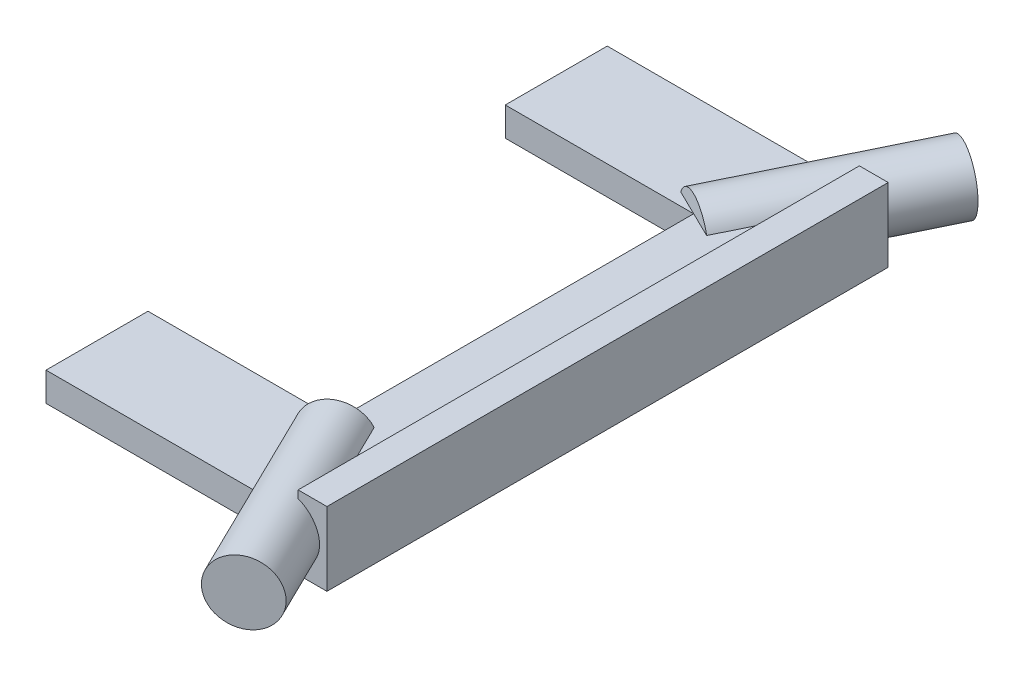
ISO-10303-21;
HEADER;
FILE_DESCRIPTION(('STEP AP214'),'2;1');
FILE_NAME('part.step','',(''),(''),'','','');
FILE_SCHEMA(('AUTOMOTIVE_DESIGN { 1 0 10303 214 1 1 1 1 }'));
ENDSEC;
DATA;
#1=APPLICATION_CONTEXT('core data for automotive mechanical design processes');
#2=APPLICATION_PROTOCOL_DEFINITION('international standard','automotive_design',2000,#1);
#3=PRODUCT_CONTEXT('',#1,'mechanical');
#4=PRODUCT('Part','Part','',(#3));
#5=PRODUCT_RELATED_PRODUCT_CATEGORY('part','',(#4));
#6=PRODUCT_DEFINITION_FORMATION('','',#4);
#7=PRODUCT_DEFINITION_CONTEXT('part definition',#1,'design');
#8=PRODUCT_DEFINITION('design','',#6,#7);
#9=PRODUCT_DEFINITION_SHAPE('','',#8);
#10=(LENGTH_UNIT() NAMED_UNIT(*) SI_UNIT(.MILLI.,.METRE.));
#11=(NAMED_UNIT(*) PLANE_ANGLE_UNIT() SI_UNIT($,.RADIAN.));
#12=(NAMED_UNIT(*) SI_UNIT($,.STERADIAN.) SOLID_ANGLE_UNIT());
#13=UNCERTAINTY_MEASURE_WITH_UNIT(LENGTH_MEASURE(1.E-05),#10,'distance_accuracy_value','');
#14=(GEOMETRIC_REPRESENTATION_CONTEXT(3) GLOBAL_UNCERTAINTY_ASSIGNED_CONTEXT((#13)) GLOBAL_UNIT_ASSIGNED_CONTEXT((#10,
#11,#12)) REPRESENTATION_CONTEXT('',''));
#15=CARTESIAN_POINT('',(0.,0.,0.));
#16=DIRECTION('',(0.,0.,1.));
#17=DIRECTION('',(1.,0.,0.));
#18=AXIS2_PLACEMENT_3D('',#15,#16,#17);
#19=CARTESIAN_POINT('',(0.,2.5,0.));
#20=DIRECTION('',(0.,-1.,0.));
#21=DIRECTION('',(0.,0.,-1.));
#22=AXIS2_PLACEMENT_3D('',#19,#20,#21);
#23=PLANE('',#22);
#24=DIRECTION('',(-1.,0.,0.));
#25=VECTOR('',#24,1.);
#26=CARTESIAN_POINT('',(-36.055,2.5,-48.7));
#27=LINE('',#26,#25);
#28=CARTESIAN_POINT('',(23.1966005210723,2.5,-48.7));
#29=VERTEX_POINT('',#28);
#30=CARTESIAN_POINT('',(-12.7,2.5,-48.7));
#31=VERTEX_POINT('',#30);
#32=EDGE_CURVE('E179',#29,#31,#27,.T.);
#33=ORIENTED_EDGE('',*,*,#32,.T.);
#34=DIRECTION('',(0.,0.,1.));
#35=VECTOR('',#34,1.);
#36=CARTESIAN_POINT('',(-12.7,2.5,0.));
#37=LINE('',#36,#35);
#38=CARTESIAN_POINT('',(-12.7,2.5,-31.));
#39=VERTEX_POINT('',#38);
#40=EDGE_CURVE('E169',#31,#39,#37,.T.);
#41=ORIENTED_EDGE('',*,*,#40,.T.);
#42=DIRECTION('',(1.,0.,0.));
#43=VECTOR('',#42,1.);
#44=CARTESIAN_POINT('',(0.,2.5,-31.));
#45=LINE('',#44,#43);
#46=CARTESIAN_POINT('',(20.,2.5,-31.));
#47=VERTEX_POINT('',#46);
#48=EDGE_CURVE('E176',#39,#47,#45,.T.);
#49=ORIENTED_EDGE('',*,*,#48,.T.);
#50=DIRECTION('',(0.898467181300484,0.,0.439040686185192));
#51=VECTOR('',#50,1.);
#52=CARTESIAN_POINT('',(16.0835075641035,2.5,-32.9138145079559));
#53=LINE('',#52,#51);
#54=CARTESIAN_POINT('',(15.5984277103543,2.5,-33.1508513149502));
#55=VERTEX_POINT('',#54);
#56=EDGE_CURVE('E306',#55,#47,#53,.T.);
#57=ORIENTED_EDGE('',*,*,#56,.F.);
#58=DIRECTION('',(-0.439040686185192,0.,0.898467181300484));
#59=VECTOR('',#58,1.);
#60=CARTESIAN_POINT('',(15.5984277103543,2.5,-33.1508513149502));
#61=LINE('',#60,#59);
#62=EDGE_CURVE('E314',#29,#55,#61,.T.);
#63=ORIENTED_EDGE('',*,*,#62,.F.);
#64=EDGE_LOOP('',(#33,#41,#49,#57,#63));
#65=FACE_BOUND('',#64,.T.);
#66=ADVANCED_FACE('F34',(#65),#23,.F.);
#67=CARTESIAN_POINT('',(0.,-2.5,0.));
#68=DIRECTION('',(0.,-1.,0.));
#69=DIRECTION('',(0.,0.,-1.));
#70=AXIS2_PLACEMENT_3D('',#67,#68,#69);
#71=PLANE('',#70);
#72=DIRECTION('',(0.,0.,1.));
#73=VECTOR('',#72,1.);
#74=CARTESIAN_POINT('',(-12.7,-2.5,0.));
#75=LINE('',#74,#73);
#76=CARTESIAN_POINT('',(-12.7,-2.5,-48.7));
#77=VERTEX_POINT('',#76);
#78=CARTESIAN_POINT('',(-12.7,-2.5,-31.));
#79=VERTEX_POINT('',#78);
#80=EDGE_CURVE('E57',#77,#79,#75,.T.);
#81=ORIENTED_EDGE('',*,*,#80,.F.);
#82=DIRECTION('',(-1.,0.,0.));
#83=VECTOR('',#82,1.);
#84=CARTESIAN_POINT('',(-36.055,-2.5,-48.7));
#85=LINE('',#84,#83);
#86=CARTESIAN_POINT('',(23.1966005210723,-2.5,-48.7));
#87=VERTEX_POINT('',#86);
#88=EDGE_CURVE('E233',#87,#77,#85,.T.);
#89=ORIENTED_EDGE('',*,*,#88,.F.);
#90=DIRECTION('',(-0.439040686185192,0.,0.898467181300484));
#91=VECTOR('',#90,1.);
#92=CARTESIAN_POINT('',(15.5984277103543,-2.5,-33.1508513149502));
#93=LINE('',#92,#91);
#94=CARTESIAN_POINT('',(15.5984277103543,-2.5,-33.1508513149502));
#95=VERTEX_POINT('',#94);
#96=EDGE_CURVE('E312',#87,#95,#93,.T.);
#97=ORIENTED_EDGE('',*,*,#96,.T.);
#98=DIRECTION('',(0.898467181300484,0.,0.439040686185192));
#99=VECTOR('',#98,1.);
#100=CARTESIAN_POINT('',(16.0835075641035,-2.5,-32.9138145079559));
#101=LINE('',#100,#99);
#102=CARTESIAN_POINT('',(20.,-2.5,-31.));
#103=VERTEX_POINT('',#102);
#104=EDGE_CURVE('E324',#95,#103,#101,.T.);
#105=ORIENTED_EDGE('',*,*,#104,.T.);
#106=DIRECTION('',(1.,0.,0.));
#107=VECTOR('',#106,1.);
#108=CARTESIAN_POINT('',(0.,-2.5,-31.));
#109=LINE('',#108,#107);
#110=EDGE_CURVE('E245',#79,#103,#109,.T.);
#111=ORIENTED_EDGE('',*,*,#110,.F.);
#112=EDGE_LOOP('',(#81,#89,#97,#105,#111));
#113=FACE_BOUND('',#112,.T.);
#114=ADVANCED_FACE('F332',(#113),#71,.T.);
#115=DIRECTION('',(-1.,0.,0.));
#116=VECTOR('',#115,1.);
#117=CARTESIAN_POINT('',(0.,2.5,31.));
#118=LINE('',#117,#116);
#119=CARTESIAN_POINT('',(20.,2.5,31.));
#120=VERTEX_POINT('',#119);
#121=CARTESIAN_POINT('',(-12.7,2.5,31.));
#122=VERTEX_POINT('',#121);
#123=EDGE_CURVE('E187',#120,#122,#118,.T.);
#124=ORIENTED_EDGE('',*,*,#123,.T.);
#125=CARTESIAN_POINT('',(-12.7,2.5,48.7));
#126=VERTEX_POINT('',#125);
#127=EDGE_CURVE('E49',#122,#126,#37,.T.);
#128=ORIENTED_EDGE('',*,*,#127,.T.);
#129=DIRECTION('',(1.,0.,0.));
#130=VECTOR('',#129,1.);
#131=CARTESIAN_POINT('',(-36.055,2.5,48.7));
#132=LINE('',#131,#130);
#133=CARTESIAN_POINT('',(23.1966005210723,2.5,48.7));
#134=VERTEX_POINT('',#133);
#135=EDGE_CURVE('E235',#126,#134,#132,.T.);
#136=ORIENTED_EDGE('',*,*,#135,.T.);
#137=DIRECTION('',(-0.439040686185192,0.,-0.898467181300484));
#138=VECTOR('',#137,1.);
#139=CARTESIAN_POINT('',(15.5984277103543,2.5,33.1508513149502));
#140=LINE('',#139,#138);
#141=CARTESIAN_POINT('',(15.5984277103543,2.5,33.1508513149502));
#142=VERTEX_POINT('',#141);
#143=EDGE_CURVE('E361',#142,#134,#140,.F.);
#144=ORIENTED_EDGE('',*,*,#143,.F.);
#145=DIRECTION('',(-0.898467181300484,0.,0.439040686185192));
#146=VECTOR('',#145,1.);
#147=CARTESIAN_POINT('',(16.0835075641035,2.5,32.9138145079559));
#148=LINE('',#147,#146);
#149=EDGE_CURVE('E398',#120,#142,#148,.T.);
#150=ORIENTED_EDGE('',*,*,#149,.F.);
#151=EDGE_LOOP('',(#124,#128,#136,#144,#150));
#152=FACE_BOUND('',#151,.T.);
#153=ADVANCED_FACE('F383',(#152),#23,.F.);
#154=CARTESIAN_POINT('',(24.4015722896457,2.5,28.8491486850498));
#155=VERTEX_POINT('',#154);
#156=EDGE_CURVE('E404',#155,#120,#148,.T.);
#157=ORIENTED_EDGE('',*,*,#156,.F.);
#158=DIRECTION('',(-0.439040686185192,0.,-0.898467181300484));
#159=VECTOR('',#158,1.);
#160=CARTESIAN_POINT('',(24.4015722896457,2.5,28.8491486850498));
#161=LINE('',#160,#159);
#162=CARTESIAN_POINT('',(31.055,2.5,42.4649401800253));
#163=VERTEX_POINT('',#162);
#164=EDGE_CURVE('E262',#163,#155,#161,.T.);
#165=ORIENTED_EDGE('',*,*,#164,.F.);
#166=DIRECTION('',(0.,0.,1.));
#167=VECTOR('',#166,1.);
#168=CARTESIAN_POINT('',(31.055,2.5,0.));
#169=LINE('',#168,#167);
#170=CARTESIAN_POINT('',(31.055,2.5,-42.4649401800253));
#171=VERTEX_POINT('',#170);
#172=EDGE_CURVE('E231',#171,#163,#169,.T.);
#173=ORIENTED_EDGE('',*,*,#172,.F.);
#174=DIRECTION('',(-0.439040686185192,0.,0.898467181300484));
#175=VECTOR('',#174,1.);
#176=CARTESIAN_POINT('',(24.4015722896457,2.5,-28.8491486850498));
#177=LINE('',#176,#175);
#178=CARTESIAN_POINT('',(24.4015722896457,2.5,-28.8491486850498));
#179=VERTEX_POINT('',#178);
#180=EDGE_CURVE('E293',#179,#171,#177,.F.);
#181=ORIENTED_EDGE('',*,*,#180,.F.);
#182=EDGE_CURVE('E319',#47,#179,#53,.T.);
#183=ORIENTED_EDGE('',*,*,#182,.F.);
#184=DIRECTION('',(0.,0.,1.));
#185=VECTOR('',#184,1.);
#186=CARTESIAN_POINT('',(20.,2.5,0.));
#187=LINE('',#186,#185);
#188=EDGE_CURVE('E191',#47,#120,#187,.T.);
#189=ORIENTED_EDGE('',*,*,#188,.T.);
#190=EDGE_LOOP('',(#157,#165,#173,#181,#183,#189));
#191=FACE_BOUND('',#190,.T.);
#192=ADVANCED_FACE('F292',(#191),#23,.F.);
#193=CARTESIAN_POINT('',(-12.7,-2.5,31.));
#194=VERTEX_POINT('',#193);
#195=CARTESIAN_POINT('',(-12.7,-2.5,48.7));
#196=VERTEX_POINT('',#195);
#197=EDGE_CURVE('E423',#194,#196,#75,.T.);
#198=ORIENTED_EDGE('',*,*,#197,.F.);
#199=DIRECTION('',(-1.,0.,0.));
#200=VECTOR('',#199,1.);
#201=CARTESIAN_POINT('',(0.,-2.5,31.));
#202=LINE('',#201,#200);
#203=CARTESIAN_POINT('',(20.,-2.5,31.));
#204=VERTEX_POINT('',#203);
#205=EDGE_CURVE('E247',#204,#194,#202,.T.);
#206=ORIENTED_EDGE('',*,*,#205,.F.);
#207=DIRECTION('',(-0.898467181300484,0.,0.439040686185192));
#208=VECTOR('',#207,1.);
#209=CARTESIAN_POINT('',(16.0835075641035,-2.5,32.9138145079559));
#210=LINE('',#209,#208);
#211=CARTESIAN_POINT('',(15.5984277103543,-2.5,33.1508513149502));
#212=VERTEX_POINT('',#211);
#213=EDGE_CURVE('E409',#204,#212,#210,.T.);
#214=ORIENTED_EDGE('',*,*,#213,.T.);
#215=DIRECTION('',(-0.439040686185192,0.,-0.898467181300484));
#216=VECTOR('',#215,1.);
#217=CARTESIAN_POINT('',(15.5984277103543,-2.5,33.1508513149502));
#218=LINE('',#217,#216);
#219=CARTESIAN_POINT('',(23.1966005210723,-2.5,48.7));
#220=VERTEX_POINT('',#219);
#221=EDGE_CURVE('E359',#212,#220,#218,.F.);
#222=ORIENTED_EDGE('',*,*,#221,.T.);
#223=DIRECTION('',(1.,0.,0.));
#224=VECTOR('',#223,1.);
#225=CARTESIAN_POINT('',(-36.055,-2.5,48.7));
#226=LINE('',#225,#224);
#227=EDGE_CURVE('E236',#196,#220,#226,.T.);
#228=ORIENTED_EDGE('',*,*,#227,.F.);
#229=EDGE_LOOP('',(#198,#206,#214,#222,#228));
#230=FACE_BOUND('',#229,.T.);
#231=ADVANCED_FACE('F388',(#230),#71,.T.);
#232=DIRECTION('',(-0.439040686185192,0.,-0.898467181300484));
#233=VECTOR('',#232,1.);
#234=CARTESIAN_POINT('',(24.4015722896457,-2.5,28.8491486850498));
#235=LINE('',#234,#233);
#236=CARTESIAN_POINT('',(31.055,-2.5,42.4649401800253));
#237=VERTEX_POINT('',#236);
#238=CARTESIAN_POINT('',(24.4015722896457,-2.5,28.8491486850498));
#239=VERTEX_POINT('',#238);
#240=EDGE_CURVE('E352',#237,#239,#235,.T.);
#241=ORIENTED_EDGE('',*,*,#240,.T.);
#242=EDGE_CURVE('E345',#239,#204,#210,.T.);
#243=ORIENTED_EDGE('',*,*,#242,.T.);
#244=DIRECTION('',(0.,0.,1.));
#245=VECTOR('',#244,1.);
#246=CARTESIAN_POINT('',(20.,-2.5,0.));
#247=LINE('',#246,#245);
#248=EDGE_CURVE('E250',#103,#204,#247,.T.);
#249=ORIENTED_EDGE('',*,*,#248,.F.);
#250=CARTESIAN_POINT('',(24.4015722896457,-2.5,-28.8491486850498));
#251=VERTEX_POINT('',#250);
#252=EDGE_CURVE('E320',#103,#251,#101,.T.);
#253=ORIENTED_EDGE('',*,*,#252,.T.);
#254=DIRECTION('',(-0.439040686185192,0.,0.898467181300484));
#255=VECTOR('',#254,1.);
#256=CARTESIAN_POINT('',(24.4015722896457,-2.5,-28.8491486850498));
#257=LINE('',#256,#255);
#258=CARTESIAN_POINT('',(31.055,-2.5,-42.4649401800253));
#259=VERTEX_POINT('',#258);
#260=EDGE_CURVE('E304',#251,#259,#257,.F.);
#261=ORIENTED_EDGE('',*,*,#260,.T.);
#262=DIRECTION('',(0.,0.,1.));
#263=VECTOR('',#262,1.);
#264=CARTESIAN_POINT('',(31.055,-2.5,0.));
#265=LINE('',#264,#263);
#266=EDGE_CURVE('E228',#259,#237,#265,.T.);
#267=ORIENTED_EDGE('',*,*,#266,.T.);
#268=EDGE_LOOP('',(#241,#243,#249,#253,#261,#267));
#269=FACE_BOUND('',#268,.T.);
#270=ADVANCED_FACE('F342',(#269),#71,.T.);
#271=CARTESIAN_POINT('',(-36.055,2.5,48.7));
#272=DIRECTION('',(0.,0.,-1.));
#273=DIRECTION('',(-1.,0.,0.));
#274=AXIS2_PLACEMENT_3D('',#271,#272,#273);
#275=PLANE('',#274);
#276=CARTESIAN_POINT('',(28.649197552469,0.,48.7));
#277=DIRECTION('',(0.,0.,-1.));
#278=DIRECTION('',(-1.,0.,0.));
#279=AXIS2_PLACEMENT_3D('',#276,#277,#278);
#280=ELLIPSE('',#279,6.12153689580408,5.50000000000001);
#281=CARTESIAN_POINT('',(31.055,-5.05744682779402,48.7));
#282=VERTEX_POINT('',#281);
#283=CARTESIAN_POINT('',(31.055,5.05744682779403,48.7));
#284=VERTEX_POINT('',#283);
#285=EDGE_CURVE('E265',#282,#284,#280,.F.);
#286=ORIENTED_EDGE('',*,*,#285,.F.);
#287=DIRECTION('',(0.,-1.,0.));
#288=VECTOR('',#287,1.);
#289=CARTESIAN_POINT('',(31.055,6.375,48.7));
#290=LINE('',#289,#288);
#291=CARTESIAN_POINT('',(31.055,-6.375,48.7));
#292=VERTEX_POINT('',#291);
#293=EDGE_CURVE('E211',#282,#292,#290,.T.);
#294=ORIENTED_EDGE('',*,*,#293,.T.);
#295=DIRECTION('',(1.,0.,0.));
#296=VECTOR('',#295,1.);
#297=CARTESIAN_POINT('',(36.055,-6.375,48.7));
#298=LINE('',#297,#296);
#299=CARTESIAN_POINT('',(36.055,-6.375,48.7));
#300=VERTEX_POINT('',#299);
#301=EDGE_CURVE('E204',#292,#300,#298,.T.);
#302=ORIENTED_EDGE('',*,*,#301,.T.);
#303=DIRECTION('',(0.,-1.,0.));
#304=VECTOR('',#303,1.);
#305=CARTESIAN_POINT('',(36.055,2.5,48.7));
#306=LINE('',#305,#304);
#307=CARTESIAN_POINT('',(36.055,6.375,48.7));
#308=VERTEX_POINT('',#307);
#309=EDGE_CURVE('E238',#308,#300,#306,.T.);
#310=ORIENTED_EDGE('',*,*,#309,.F.);
#311=DIRECTION('',(1.,0.,0.));
#312=VECTOR('',#311,1.);
#313=CARTESIAN_POINT('',(36.055,6.375,48.7));
#314=LINE('',#313,#312);
#315=CARTESIAN_POINT('',(31.055,6.375,48.7));
#316=VERTEX_POINT('',#315);
#317=EDGE_CURVE('E208',#316,#308,#314,.T.);
#318=ORIENTED_EDGE('',*,*,#317,.F.);
#319=EDGE_CURVE('E222',#316,#284,#290,.T.);
#320=ORIENTED_EDGE('',*,*,#319,.T.);
#321=EDGE_LOOP('',(#286,#294,#302,#310,#318,#320));
#322=FACE_BOUND('',#321,.T.);
#323=ADVANCED_FACE('F273',(#322),#275,.F.);
#324=CARTESIAN_POINT('',(-36.055,2.5,-48.7));
#325=DIRECTION('',(0.,0.,1.));
#326=DIRECTION('',(1.,0.,0.));
#327=AXIS2_PLACEMENT_3D('',#324,#325,#326);
#328=PLANE('',#327);
#329=CARTESIAN_POINT('',(28.649197552469,0.,-48.7));
#330=DIRECTION('',(0.,0.,1.));
#331=DIRECTION('',(-1.,0.,0.));
#332=AXIS2_PLACEMENT_3D('',#329,#330,#331);
#333=ELLIPSE('',#332,6.12153689580408,5.50000000000001);
#334=CARTESIAN_POINT('',(31.055,5.05744682779403,-48.7));
#335=VERTEX_POINT('',#334);
#336=CARTESIAN_POINT('',(31.055,-5.05744682779403,-48.7));
#337=VERTEX_POINT('',#336);
#338=EDGE_CURVE('E288',#335,#337,#333,.F.);
#339=ORIENTED_EDGE('',*,*,#338,.F.);
#340=DIRECTION('',(0.,-1.,0.));
#341=VECTOR('',#340,1.);
#342=CARTESIAN_POINT('',(31.055,6.375,-48.7));
#343=LINE('',#342,#341);
#344=CARTESIAN_POINT('',(31.055,6.375,-48.7));
#345=VERTEX_POINT('',#344);
#346=EDGE_CURVE('E226',#345,#335,#343,.T.);
#347=ORIENTED_EDGE('',*,*,#346,.F.);
#348=DIRECTION('',(-1.,0.,0.));
#349=VECTOR('',#348,1.);
#350=CARTESIAN_POINT('',(36.055,6.375,-48.7));
#351=LINE('',#350,#349);
#352=CARTESIAN_POINT('',(36.055,6.375,-48.7));
#353=VERTEX_POINT('',#352);
#354=EDGE_CURVE('E203',#353,#345,#351,.T.);
#355=ORIENTED_EDGE('',*,*,#354,.F.);
#356=DIRECTION('',(0.,-1.,0.));
#357=VECTOR('',#356,1.);
#358=CARTESIAN_POINT('',(36.055,2.5,-48.7));
#359=LINE('',#358,#357);
#360=CARTESIAN_POINT('',(36.055,-6.375,-48.7));
#361=VERTEX_POINT('',#360);
#362=EDGE_CURVE('E243',#353,#361,#359,.T.);
#363=ORIENTED_EDGE('',*,*,#362,.T.);
#364=DIRECTION('',(-1.,0.,0.));
#365=VECTOR('',#364,1.);
#366=CARTESIAN_POINT('',(36.055,-6.375,-48.7));
#367=LINE('',#366,#365);
#368=CARTESIAN_POINT('',(31.055,-6.375,-48.7));
#369=VERTEX_POINT('',#368);
#370=EDGE_CURVE('E214',#361,#369,#367,.T.);
#371=ORIENTED_EDGE('',*,*,#370,.T.);
#372=EDGE_CURVE('E225',#337,#369,#343,.T.);
#373=ORIENTED_EDGE('',*,*,#372,.F.);
#374=EDGE_LOOP('',(#339,#347,#355,#363,#371,#373));
#375=FACE_BOUND('',#374,.T.);
#376=ADVANCED_FACE('F285',(#375),#328,.F.);
#377=CARTESIAN_POINT('',(36.055,2.5,48.7));
#378=DIRECTION('',(-1.,0.,0.));
#379=DIRECTION('',(0.,0.,1.));
#380=AXIS2_PLACEMENT_3D('',#377,#378,#379);
#381=PLANE('',#380);
#382=ORIENTED_EDGE('',*,*,#309,.T.);
#383=DIRECTION('',(0.,0.,-1.));
#384=VECTOR('',#383,1.);
#385=CARTESIAN_POINT('',(36.055,-6.375,-48.7));
#386=LINE('',#385,#384);
#387=EDGE_CURVE('E199',#300,#361,#386,.T.);
#388=ORIENTED_EDGE('',*,*,#387,.T.);
#389=ORIENTED_EDGE('',*,*,#362,.F.);
#390=DIRECTION('',(0.,0.,-1.));
#391=VECTOR('',#390,1.);
#392=CARTESIAN_POINT('',(36.055,6.375,-48.7));
#393=LINE('',#392,#391);
#394=EDGE_CURVE('E200',#308,#353,#393,.T.);
#395=ORIENTED_EDGE('',*,*,#394,.F.);
#396=EDGE_LOOP('',(#382,#388,#389,#395));
#397=FACE_BOUND('',#396,.T.);
#398=ADVANCED_FACE('F36',(#397),#381,.F.);
#399=ORIENTED_EDGE('',*,*,#88,.T.);
#400=DIRECTION('',(0.,1.,0.));
#401=VECTOR('',#400,1.);
#402=CARTESIAN_POINT('',(-12.7,2.5,-48.7));
#403=LINE('',#402,#401);
#404=EDGE_CURVE('E180',#77,#31,#403,.T.);
#405=ORIENTED_EDGE('',*,*,#404,.T.);
#406=ORIENTED_EDGE('',*,*,#32,.F.);
#407=EDGE_CURVE('E308',#87,#29,#333,.F.);
#408=ORIENTED_EDGE('',*,*,#407,.F.);
#409=EDGE_LOOP('',(#399,#405,#406,#408));
#410=FACE_BOUND('',#409,.T.);
#411=ADVANCED_FACE('F488',(#410),#328,.F.);
#412=ORIENTED_EDGE('',*,*,#135,.F.);
#413=DIRECTION('',(0.,-1.,0.));
#414=VECTOR('',#413,1.);
#415=CARTESIAN_POINT('',(-12.7,2.5,48.7));
#416=LINE('',#415,#414);
#417=EDGE_CURVE('E419',#126,#196,#416,.T.);
#418=ORIENTED_EDGE('',*,*,#417,.T.);
#419=ORIENTED_EDGE('',*,*,#227,.T.);
#420=EDGE_CURVE('E354',#134,#220,#280,.F.);
#421=ORIENTED_EDGE('',*,*,#420,.F.);
#422=EDGE_LOOP('',(#412,#418,#419,#421));
#423=FACE_BOUND('',#422,.T.);
#424=ADVANCED_FACE('F429',(#423),#275,.F.);
#425=CARTESIAN_POINT('',(0.,-6.375,0.));
#426=DIRECTION('',(0.,-1.,0.));
#427=DIRECTION('',(0.,0.,-1.));
#428=AXIS2_PLACEMENT_3D('',#425,#426,#427);
#429=PLANE('',#428);
#430=ORIENTED_EDGE('',*,*,#387,.F.);
#431=ORIENTED_EDGE('',*,*,#301,.F.);
#432=DIRECTION('',(0.,0.,1.));
#433=VECTOR('',#432,1.);
#434=CARTESIAN_POINT('',(31.055,-6.375,-48.7));
#435=LINE('',#434,#433);
#436=EDGE_CURVE('E217',#369,#292,#435,.T.);
#437=ORIENTED_EDGE('',*,*,#436,.F.);
#438=ORIENTED_EDGE('',*,*,#370,.F.);
#439=EDGE_LOOP('',(#430,#431,#437,#438));
#440=FACE_BOUND('',#439,.T.);
#441=ADVANCED_FACE('F504',(#440),#429,.T.);
#442=CARTESIAN_POINT('',(31.055,6.375,-48.7));
#443=DIRECTION('',(1.,0.,0.));
#444=DIRECTION('',(0.,0.,-1.));
#445=AXIS2_PLACEMENT_3D('',#442,#443,#444);
#446=PLANE('',#445);
#447=CARTESIAN_POINT('',(31.055,0.,53.6233126036233));
#448=DIRECTION('',(1.,0.,0.));
#449=DIRECTION('',(0.,0.,-1.));
#450=AXIS2_PLACEMENT_3D('',#447,#448,#449);
#451=ELLIPSE('',#450,12.5273127823057,5.50000000000001);
#452=EDGE_CURVE('E351',#237,#282,#451,.F.);
#453=ORIENTED_EDGE('',*,*,#452,.F.);
#454=ORIENTED_EDGE('',*,*,#266,.F.);
#455=CARTESIAN_POINT('',(31.055,0.,-53.6233126036233));
#456=DIRECTION('',(1.,0.,0.));
#457=DIRECTION('',(0.,0.,1.));
#458=AXIS2_PLACEMENT_3D('',#455,#456,#457);
#459=ELLIPSE('',#458,12.5273127823057,5.50000000000001);
#460=EDGE_CURVE('E301',#337,#259,#459,.F.);
#461=ORIENTED_EDGE('',*,*,#460,.F.);
#462=ORIENTED_EDGE('',*,*,#372,.T.);
#463=ORIENTED_EDGE('',*,*,#436,.T.);
#464=ORIENTED_EDGE('',*,*,#293,.F.);
#465=EDGE_LOOP('',(#453,#454,#461,#462,#463,#464));
#466=FACE_BOUND('',#465,.T.);
#467=ADVANCED_FACE('F350',(#466),#446,.F.);
#468=CARTESIAN_POINT('',(31.055,0.,53.6233126036233));
#469=DIRECTION('',(1.,0.,0.));
#470=DIRECTION('',(0.,0.,-1.));
#471=AXIS2_PLACEMENT_3D('',#468,#469,#470);
#472=ELLIPSE('',#471,12.5273127823057,5.50000000000001);
#473=EDGE_CURVE('E42',#284,#163,#472,.F.);
#474=ORIENTED_EDGE('',*,*,#473,.F.);
#475=ORIENTED_EDGE('',*,*,#319,.F.);
#476=DIRECTION('',(0.,0.,1.));
#477=VECTOR('',#476,1.);
#478=CARTESIAN_POINT('',(31.055,6.375,-48.7));
#479=LINE('',#478,#477);
#480=EDGE_CURVE('E206',#345,#316,#479,.T.);
#481=ORIENTED_EDGE('',*,*,#480,.F.);
#482=ORIENTED_EDGE('',*,*,#346,.T.);
#483=CARTESIAN_POINT('',(31.055,0.,-53.6233126036233));
#484=DIRECTION('',(1.,0.,0.));
#485=DIRECTION('',(0.,0.,1.));
#486=AXIS2_PLACEMENT_3D('',#483,#484,#485);
#487=ELLIPSE('',#486,12.5273127823057,5.50000000000001);
#488=EDGE_CURVE('E253',#171,#335,#487,.F.);
#489=ORIENTED_EDGE('',*,*,#488,.F.);
#490=ORIENTED_EDGE('',*,*,#172,.T.);
#491=EDGE_LOOP('',(#474,#475,#481,#482,#489,#490));
#492=FACE_BOUND('',#491,.T.);
#493=ADVANCED_FACE('F268',(#492),#446,.F.);
#494=CARTESIAN_POINT('',(0.,6.375,0.));
#495=DIRECTION('',(0.,-1.,0.));
#496=DIRECTION('',(0.,0.,-1.));
#497=AXIS2_PLACEMENT_3D('',#494,#495,#496);
#498=PLANE('',#497);
#499=ORIENTED_EDGE('',*,*,#394,.T.);
#500=ORIENTED_EDGE('',*,*,#354,.T.);
#501=ORIENTED_EDGE('',*,*,#480,.T.);
#502=ORIENTED_EDGE('',*,*,#317,.T.);
#503=EDGE_LOOP('',(#499,#500,#501,#502));
#504=FACE_BOUND('',#503,.T.);
#505=ADVANCED_FACE('F277',(#504),#498,.F.);
#506=CARTESIAN_POINT('',(20.,-6.375,31.));
#507=DIRECTION('',(1.,0.,0.));
#508=DIRECTION('',(0.,0.,-1.));
#509=AXIS2_PLACEMENT_3D('',#506,#507,#508);
#510=PLANE('',#509);
#511=DIRECTION('',(0.,1.,0.));
#512=VECTOR('',#511,1.);
#513=CARTESIAN_POINT('',(20.,-6.375,-31.));
#514=LINE('',#513,#512);
#515=EDGE_CURVE('E185',#103,#47,#514,.T.);
#516=ORIENTED_EDGE('',*,*,#515,.F.);
#517=ORIENTED_EDGE('',*,*,#248,.T.);
#518=DIRECTION('',(0.,1.,0.));
#519=VECTOR('',#518,1.);
#520=CARTESIAN_POINT('',(20.,-6.375,31.));
#521=LINE('',#520,#519);
#522=EDGE_CURVE('E188',#204,#120,#521,.T.);
#523=ORIENTED_EDGE('',*,*,#522,.T.);
#524=ORIENTED_EDGE('',*,*,#188,.F.);
#525=EDGE_LOOP('',(#516,#517,#523,#524));
#526=FACE_BOUND('',#525,.T.);
#527=ADVANCED_FACE('F339',(#526),#510,.F.);
#528=CARTESIAN_POINT('',(-20.,-6.375,31.));
#529=DIRECTION('',(0.,0.,1.));
#530=DIRECTION('',(1.,0.,0.));
#531=AXIS2_PLACEMENT_3D('',#528,#529,#530);
#532=PLANE('',#531);
#533=ORIENTED_EDGE('',*,*,#205,.T.);
#534=DIRECTION('',(0.,1.,0.));
#535=VECTOR('',#534,1.);
#536=CARTESIAN_POINT('',(-12.7,-6.375,31.));
#537=LINE('',#536,#535);
#538=EDGE_CURVE('E402',#194,#122,#537,.T.);
#539=ORIENTED_EDGE('',*,*,#538,.T.);
#540=ORIENTED_EDGE('',*,*,#123,.F.);
#541=ORIENTED_EDGE('',*,*,#522,.F.);
#542=EDGE_LOOP('',(#533,#539,#540,#541));
#543=FACE_BOUND('',#542,.T.);
#544=ADVANCED_FACE('F400',(#543),#532,.F.);
#545=CARTESIAN_POINT('',(-20.,-6.375,-31.));
#546=DIRECTION('',(0.,0.,-1.));
#547=DIRECTION('',(-1.,0.,0.));
#548=AXIS2_PLACEMENT_3D('',#545,#546,#547);
#549=PLANE('',#548);
#550=ORIENTED_EDGE('',*,*,#48,.F.);
#551=DIRECTION('',(0.,-1.,0.));
#552=VECTOR('',#551,1.);
#553=CARTESIAN_POINT('',(-12.7,-6.375,-31.));
#554=LINE('',#553,#552);
#555=EDGE_CURVE('E11',#39,#79,#554,.T.);
#556=ORIENTED_EDGE('',*,*,#555,.T.);
#557=ORIENTED_EDGE('',*,*,#110,.T.);
#558=ORIENTED_EDGE('',*,*,#515,.T.);
#559=EDGE_LOOP('',(#550,#556,#557,#558));
#560=FACE_BOUND('',#559,.T.);
#561=ADVANCED_FACE('F183',(#560),#549,.F.);
#562=CARTESIAN_POINT('',(20.,0.,-31.));
#563=DIRECTION('',(-0.439040686185192,0.,0.898467181300484));
#564=DIRECTION('',(0.898467181300484,0.,0.439040686185192));
#565=AXIS2_PLACEMENT_3D('',#562,#563,#564);
#566=CYLINDRICAL_SURFACE('',#565,5.50000000000001);
#567=CARTESIAN_POINT('',(35.3664240164817,0.,-62.4463513455169));
#568=DIRECTION('',(-0.439040686185192,0.,0.898467181300484));
#569=DIRECTION('',(0.898467181300484,0.,0.439040686185192));
#570=AXIS2_PLACEMENT_3D('',#567,#568,#569);
#571=CIRCLE('',#570,5.50000000000001);
#572=CARTESIAN_POINT('',(40.3079935136344,0.,-60.0316275714984));
#573=VERTEX_POINT('',#572);
#574=EDGE_CURVE('E326',#573,#573,#571,.T.);
#575=ORIENTED_EDGE('',*,*,#574,.T.);
#576=EDGE_LOOP('',(#575));
#577=FACE_BOUND('',#576,.T.);
#578=ORIENTED_EDGE('',*,*,#407,.T.);
#579=ORIENTED_EDGE('',*,*,#62,.T.);
#580=CARTESIAN_POINT('',(20.,0.,-31.));
#581=DIRECTION('',(-0.439040686185192,0.,0.898467181300484));
#582=DIRECTION('',(0.898467181300484,0.,0.439040686185192));
#583=AXIS2_PLACEMENT_3D('',#580,#581,#582);
#584=CIRCLE('',#583,5.5);
#585=EDGE_CURVE('E300',#179,#55,#584,.T.);
#586=ORIENTED_EDGE('',*,*,#585,.F.);
#587=ORIENTED_EDGE('',*,*,#180,.T.);
#588=ORIENTED_EDGE('',*,*,#488,.T.);
#589=ORIENTED_EDGE('',*,*,#338,.T.);
#590=ORIENTED_EDGE('',*,*,#460,.T.);
#591=ORIENTED_EDGE('',*,*,#260,.F.);
#592=EDGE_CURVE('E321',#95,#251,#584,.T.);
#593=ORIENTED_EDGE('',*,*,#592,.F.);
#594=ORIENTED_EDGE('',*,*,#96,.F.);
#595=EDGE_LOOP('',(#578,#579,#586,#587,#588,#589,#590,#591,#593,#594));
#596=FACE_BOUND('',#595,.T.);
#597=ADVANCED_FACE('F297',(#577,#596),#566,.T.);
#598=CARTESIAN_POINT('',(20.,0.,-31.));
#599=DIRECTION('',(0.439040686185192,0.,-0.898467181300484));
#600=DIRECTION('',(-0.898467181300484,0.,-0.439040686185192));
#601=AXIS2_PLACEMENT_3D('',#598,#599,#600);
#602=PLANE('',#601);
#603=ORIENTED_EDGE('',*,*,#585,.T.);
#604=ORIENTED_EDGE('',*,*,#56,.T.);
#605=ORIENTED_EDGE('',*,*,#182,.T.);
#606=EDGE_LOOP('',(#603,#604,#605));
#607=FACE_BOUND('',#606,.T.);
#608=ADVANCED_FACE('F318',(#607),#602,.F.);
#609=ORIENTED_EDGE('',*,*,#104,.F.);
#610=ORIENTED_EDGE('',*,*,#592,.T.);
#611=ORIENTED_EDGE('',*,*,#252,.F.);
#612=EDGE_LOOP('',(#609,#610,#611));
#613=FACE_BOUND('',#612,.T.);
#614=ADVANCED_FACE('F346',(#613),#602,.F.);
#615=CARTESIAN_POINT('',(30.424854519329,0.,-64.8610751195355));
#616=DIRECTION('',(-0.439040686185192,0.,0.898467181300484));
#617=DIRECTION('',(0.898467181300484,0.,0.439040686185192));
#618=AXIS2_PLACEMENT_3D('',#615,#616,#617);
#619=PLANE('',#618);
#620=ORIENTED_EDGE('',*,*,#574,.F.);
#621=EDGE_LOOP('',(#620));
#622=FACE_BOUND('',#621,.T.);
#623=ADVANCED_FACE('F368',(#622),#619,.F.);
#624=CARTESIAN_POINT('',(20.,0.,31.));
#625=DIRECTION('',(-0.439040686185192,0.,-0.898467181300484));
#626=DIRECTION('',(0.898467181300484,0.,-0.439040686185192));
#627=AXIS2_PLACEMENT_3D('',#624,#625,#626);
#628=CYLINDRICAL_SURFACE('',#627,5.50000000000001);
#629=CARTESIAN_POINT('',(35.3664240164817,0.,62.4463513455169));
#630=DIRECTION('',(0.439040686185192,0.,0.898467181300484));
#631=DIRECTION('',(0.898467181300484,0.,-0.439040686185192));
#632=AXIS2_PLACEMENT_3D('',#629,#630,#631);
#633=CIRCLE('',#632,5.50000000000001);
#634=CARTESIAN_POINT('',(40.3079935136344,0.,60.0316275714984));
#635=VERTEX_POINT('',#634);
#636=EDGE_CURVE('E416',#635,#635,#633,.T.);
#637=ORIENTED_EDGE('',*,*,#636,.F.);
#638=EDGE_LOOP('',(#637));
#639=FACE_BOUND('',#638,.T.);
#640=CARTESIAN_POINT('',(20.,0.,31.));
#641=DIRECTION('',(0.439040686185192,0.,0.898467181300484));
#642=DIRECTION('',(0.898467181300484,0.,-0.439040686185192));
#643=AXIS2_PLACEMENT_3D('',#640,#641,#642);
#644=CIRCLE('',#643,5.5);
#645=EDGE_CURVE('E406',#155,#142,#644,.T.);
#646=ORIENTED_EDGE('',*,*,#645,.T.);
#647=ORIENTED_EDGE('',*,*,#143,.T.);
#648=ORIENTED_EDGE('',*,*,#420,.T.);
#649=ORIENTED_EDGE('',*,*,#221,.F.);
#650=EDGE_CURVE('E413',#212,#239,#644,.T.);
#651=ORIENTED_EDGE('',*,*,#650,.T.);
#652=ORIENTED_EDGE('',*,*,#240,.F.);
#653=ORIENTED_EDGE('',*,*,#452,.T.);
#654=ORIENTED_EDGE('',*,*,#285,.T.);
#655=ORIENTED_EDGE('',*,*,#473,.T.);
#656=ORIENTED_EDGE('',*,*,#164,.T.);
#657=EDGE_LOOP('',(#646,#647,#648,#649,#651,#652,#653,#654,#655,#656));
#658=FACE_BOUND('',#657,.T.);
#659=ADVANCED_FACE('F260',(#639,#658),#628,.T.);
#660=CARTESIAN_POINT('',(20.,0.,31.));
#661=DIRECTION('',(0.439040686185192,0.,0.898467181300484));
#662=DIRECTION('',(-0.898467181300484,0.,0.439040686185192));
#663=AXIS2_PLACEMENT_3D('',#660,#661,#662);
#664=PLANE('',#663);
#665=ORIENTED_EDGE('',*,*,#645,.F.);
#666=ORIENTED_EDGE('',*,*,#156,.T.);
#667=ORIENTED_EDGE('',*,*,#149,.T.);
#668=EDGE_LOOP('',(#665,#666,#667));
#669=FACE_BOUND('',#668,.T.);
#670=ADVANCED_FACE('F375',(#669),#664,.F.);
#671=ORIENTED_EDGE('',*,*,#242,.F.);
#672=ORIENTED_EDGE('',*,*,#650,.F.);
#673=ORIENTED_EDGE('',*,*,#213,.F.);
#674=EDGE_LOOP('',(#671,#672,#673));
#675=FACE_BOUND('',#674,.T.);
#676=ADVANCED_FACE('F434',(#675),#664,.F.);
#677=CARTESIAN_POINT('',(30.424854519329,0.,64.8610751195355));
#678=DIRECTION('',(-0.439040686185192,0.,-0.898467181300484));
#679=DIRECTION('',(0.898467181300484,0.,-0.439040686185192));
#680=AXIS2_PLACEMENT_3D('',#677,#678,#679);
#681=PLANE('',#680);
#682=ORIENTED_EDGE('',*,*,#636,.T.);
#683=EDGE_LOOP('',(#682));
#684=FACE_BOUND('',#683,.T.);
#685=ADVANCED_FACE('F436',(#684),#681,.F.);
#686=CARTESIAN_POINT('',(-12.7,-6.375,-76.2));
#687=DIRECTION('',(1.,0.,0.));
#688=DIRECTION('',(0.,0.,-1.));
#689=AXIS2_PLACEMENT_3D('',#686,#687,#688);
#690=PLANE('',#689);
#691=ORIENTED_EDGE('',*,*,#80,.T.);
#692=ORIENTED_EDGE('',*,*,#555,.F.);
#693=ORIENTED_EDGE('',*,*,#40,.F.);
#694=ORIENTED_EDGE('',*,*,#404,.F.);
#695=EDGE_LOOP('',(#691,#692,#693,#694));
#696=FACE_BOUND('',#695,.T.);
#697=ADVANCED_FACE('F168',(#696),#690,.F.);
#698=ORIENTED_EDGE('',*,*,#127,.F.);
#699=ORIENTED_EDGE('',*,*,#538,.F.);
#700=ORIENTED_EDGE('',*,*,#197,.T.);
#701=ORIENTED_EDGE('',*,*,#417,.F.);
#702=EDGE_LOOP('',(#698,#699,#700,#701));
#703=FACE_BOUND('',#702,.T.);
#704=ADVANCED_FACE('F426',(#703),#690,.F.);
#705=CLOSED_SHELL('',(#66,#114,#153,#192,#231,#270,#323,#376,#398,#411,#424,#441,#467,#493,#505,
#527,#544,#561,#597,#608,#614,#623,#659,#670,#676,#685,#697,#704));
#706=MANIFOLD_SOLID_BREP('B2',#705);
#707=ADVANCED_BREP_SHAPE_REPRESENTATION('',(#18,#706),#14);
#708=SHAPE_DEFINITION_REPRESENTATION(#9,#707);
ENDSEC;
END-ISO-10303-21;
